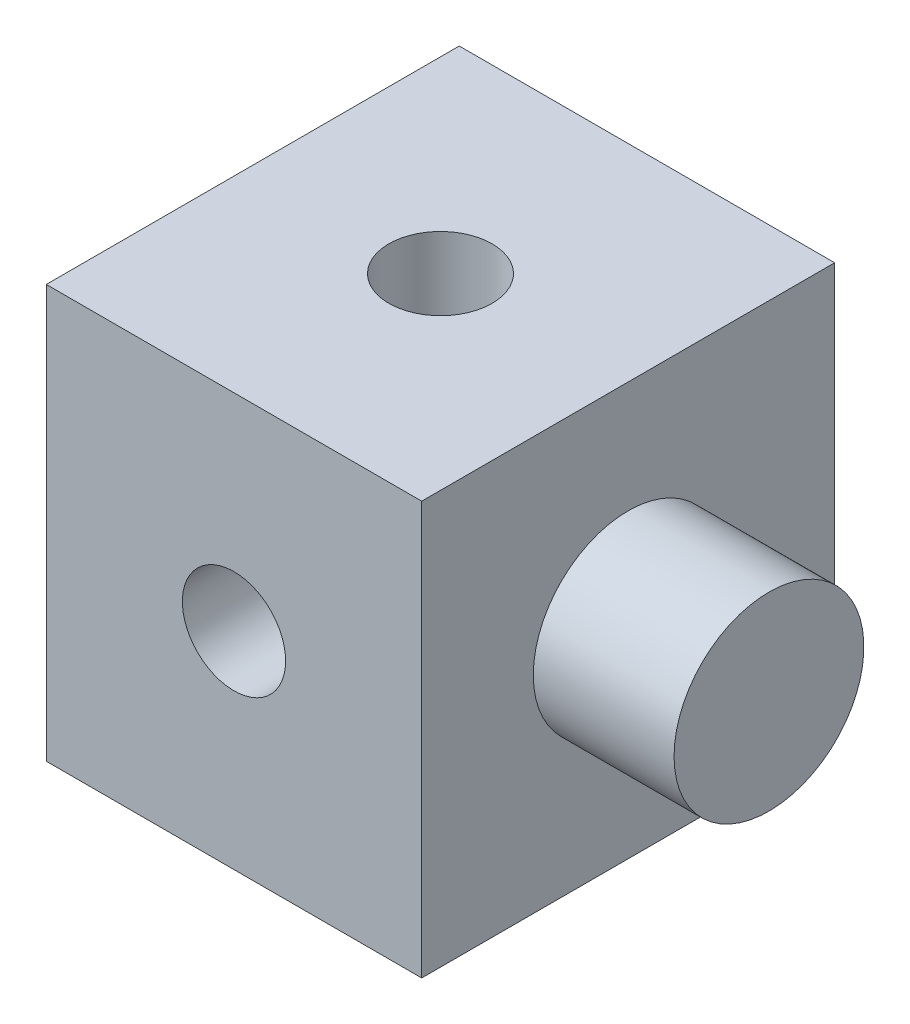
ISO-10303-21;
HEADER;
FILE_DESCRIPTION(('STEP AP214'),'2;1');
FILE_NAME('part.step','',(''),(''),'','','');
FILE_SCHEMA(('AUTOMOTIVE_DESIGN { 1 0 10303 214 1 1 1 1 }'));
ENDSEC;
DATA;
#1=APPLICATION_CONTEXT('core data for automotive mechanical design processes');
#2=APPLICATION_PROTOCOL_DEFINITION('international standard','automotive_design',2000,#1);
#3=PRODUCT_CONTEXT('',#1,'mechanical');
#4=PRODUCT('Part','Part','',(#3));
#5=PRODUCT_RELATED_PRODUCT_CATEGORY('part','',(#4));
#6=PRODUCT_DEFINITION_FORMATION('','',#4);
#7=PRODUCT_DEFINITION_CONTEXT('part definition',#1,'design');
#8=PRODUCT_DEFINITION('design','',#6,#7);
#9=PRODUCT_DEFINITION_SHAPE('','',#8);
#10=(LENGTH_UNIT() NAMED_UNIT(*) SI_UNIT(.MILLI.,.METRE.));
#11=(NAMED_UNIT(*) PLANE_ANGLE_UNIT() SI_UNIT($,.RADIAN.));
#12=(NAMED_UNIT(*) SI_UNIT($,.STERADIAN.) SOLID_ANGLE_UNIT());
#13=UNCERTAINTY_MEASURE_WITH_UNIT(LENGTH_MEASURE(1.E-05),#10,'distance_accuracy_value','');
#14=(GEOMETRIC_REPRESENTATION_CONTEXT(3) GLOBAL_UNCERTAINTY_ASSIGNED_CONTEXT((#13)) GLOBAL_UNIT_ASSIGNED_CONTEXT((#10,
#11,#12)) REPRESENTATION_CONTEXT('',''));
#15=CARTESIAN_POINT('',(0.,0.,0.));
#16=DIRECTION('',(0.,0.,1.));
#17=DIRECTION('',(1.,0.,0.));
#18=AXIS2_PLACEMENT_3D('',#15,#16,#17);
#19=CARTESIAN_POINT('',(-40.,22.,22.));
#20=DIRECTION('',(1.,0.,0.));
#21=DIRECTION('',(0.,0.,-1.));
#22=AXIS2_PLACEMENT_3D('',#19,#20,#21);
#23=PLANE('',#22);
#24=CARTESIAN_POINT('',(-40.,0.,0.));
#25=DIRECTION('',(1.,0.,0.));
#26=DIRECTION('',(0.,0.,-1.));
#27=AXIS2_PLACEMENT_3D('',#24,#25,#26);
#28=CIRCLE('',#27,7.2);
#29=CARTESIAN_POINT('',(-40.,0.,-7.2));
#30=VERTEX_POINT('',#29);
#31=EDGE_CURVE('E116',#30,#30,#28,.F.);
#32=ORIENTED_EDGE('',*,*,#31,.F.);
#33=EDGE_LOOP('',(#32));
#34=FACE_BOUND('',#33,.T.);
#35=DIRECTION('',(0.,-1.,0.));
#36=VECTOR('',#35,1.);
#37=CARTESIAN_POINT('',(-40.,22.,-22.));
#38=LINE('',#37,#36);
#39=CARTESIAN_POINT('',(-40.,22.,-22.));
#40=VERTEX_POINT('',#39);
#41=CARTESIAN_POINT('',(-40.,-22.,-22.));
#42=VERTEX_POINT('',#41);
#43=EDGE_CURVE('E110',#40,#42,#38,.T.);
#44=ORIENTED_EDGE('',*,*,#43,.T.);
#45=DIRECTION('',(0.,0.,-1.));
#46=VECTOR('',#45,1.);
#47=CARTESIAN_POINT('',(-40.,-22.,22.));
#48=LINE('',#47,#46);
#49=CARTESIAN_POINT('',(-40.,-22.,22.));
#50=VERTEX_POINT('',#49);
#51=EDGE_CURVE('E11',#50,#42,#48,.T.);
#52=ORIENTED_EDGE('',*,*,#51,.F.);
#53=DIRECTION('',(0.,-1.,0.));
#54=VECTOR('',#53,1.);
#55=CARTESIAN_POINT('',(-40.,22.,22.));
#56=LINE('',#55,#54);
#57=CARTESIAN_POINT('',(-40.,22.,22.));
#58=VERTEX_POINT('',#57);
#59=EDGE_CURVE('E91',#58,#50,#56,.T.);
#60=ORIENTED_EDGE('',*,*,#59,.F.);
#61=DIRECTION('',(0.,0.,-1.));
#62=VECTOR('',#61,1.);
#63=CARTESIAN_POINT('',(-40.,22.,22.));
#64=LINE('',#63,#62);
#65=EDGE_CURVE('E101',#58,#40,#64,.T.);
#66=ORIENTED_EDGE('',*,*,#65,.T.);
#67=EDGE_LOOP('',(#44,#52,#60,#66));
#68=FACE_BOUND('',#67,.T.);
#69=ADVANCED_FACE('F41',(#34,#68),#23,.F.);
#70=CARTESIAN_POINT('',(-40.,-22.,22.));
#71=DIRECTION('',(0.,1.,0.));
#72=DIRECTION('',(0.,0.,1.));
#73=AXIS2_PLACEMENT_3D('',#70,#71,#72);
#74=PLANE('',#73);
#75=CARTESIAN_POINT('',(-20.,-22.,0.));
#76=DIRECTION('',(0.,1.,0.));
#77=DIRECTION('',(0.,0.,1.));
#78=AXIS2_PLACEMENT_3D('',#75,#76,#77);
#79=CIRCLE('',#78,5.5);
#80=CARTESIAN_POINT('',(-20.,-22.,5.5));
#81=VERTEX_POINT('',#80);
#82=EDGE_CURVE('E123',#81,#81,#79,.T.);
#83=ORIENTED_EDGE('',*,*,#82,.T.);
#84=EDGE_LOOP('',(#83));
#85=FACE_BOUND('',#84,.T.);
#86=DIRECTION('',(1.,0.,0.));
#87=VECTOR('',#86,1.);
#88=CARTESIAN_POINT('',(-40.,-22.,-22.));
#89=LINE('',#88,#87);
#90=CARTESIAN_POINT('',(0.,-22.,-22.));
#91=VERTEX_POINT('',#90);
#92=EDGE_CURVE('E96',#42,#91,#89,.T.);
#93=ORIENTED_EDGE('',*,*,#92,.T.);
#94=DIRECTION('',(0.,0.,-1.));
#95=VECTOR('',#94,1.);
#96=CARTESIAN_POINT('',(0.,-22.,22.));
#97=LINE('',#96,#95);
#98=CARTESIAN_POINT('',(0.,-22.,22.));
#99=VERTEX_POINT('',#98);
#100=EDGE_CURVE('E49',#99,#91,#97,.T.);
#101=ORIENTED_EDGE('',*,*,#100,.F.);
#102=DIRECTION('',(1.,0.,0.));
#103=VECTOR('',#102,1.);
#104=CARTESIAN_POINT('',(-40.,-22.,22.));
#105=LINE('',#104,#103);
#106=EDGE_CURVE('E89',#50,#99,#105,.T.);
#107=ORIENTED_EDGE('',*,*,#106,.F.);
#108=ORIENTED_EDGE('',*,*,#51,.T.);
#109=EDGE_LOOP('',(#93,#101,#107,#108));
#110=FACE_BOUND('',#109,.T.);
#111=ADVANCED_FACE('F97',(#85,#110),#74,.F.);
#112=CARTESIAN_POINT('',(0.,-22.,22.));
#113=DIRECTION('',(-1.,0.,0.));
#114=DIRECTION('',(0.,0.,1.));
#115=AXIS2_PLACEMENT_3D('',#112,#113,#114);
#116=PLANE('',#115);
#117=CARTESIAN_POINT('',(0.,0.,0.));
#118=DIRECTION('',(-1.,0.,0.));
#119=DIRECTION('',(0.,0.,1.));
#120=AXIS2_PLACEMENT_3D('',#117,#118,#119);
#121=CIRCLE('',#120,10.1125);
#122=CARTESIAN_POINT('',(0.,0.,10.1125));
#123=VERTEX_POINT('',#122);
#124=EDGE_CURVE('E118',#123,#123,#121,.T.);
#125=ORIENTED_EDGE('',*,*,#124,.T.);
#126=EDGE_LOOP('',(#125));
#127=FACE_BOUND('',#126,.T.);
#128=DIRECTION('',(0.,1.,0.));
#129=VECTOR('',#128,1.);
#130=CARTESIAN_POINT('',(0.,-22.,-22.));
#131=LINE('',#130,#129);
#132=CARTESIAN_POINT('',(0.,22.,-22.));
#133=VERTEX_POINT('',#132);
#134=EDGE_CURVE('E77',#91,#133,#131,.T.);
#135=ORIENTED_EDGE('',*,*,#134,.T.);
#136=DIRECTION('',(0.,0.,-1.));
#137=VECTOR('',#136,1.);
#138=CARTESIAN_POINT('',(0.,22.,22.));
#139=LINE('',#138,#137);
#140=CARTESIAN_POINT('',(0.,22.,22.));
#141=VERTEX_POINT('',#140);
#142=EDGE_CURVE('E100',#141,#133,#139,.T.);
#143=ORIENTED_EDGE('',*,*,#142,.F.);
#144=DIRECTION('',(0.,1.,0.));
#145=VECTOR('',#144,1.);
#146=CARTESIAN_POINT('',(0.,-22.,22.));
#147=LINE('',#146,#145);
#148=EDGE_CURVE('E94',#99,#141,#147,.T.);
#149=ORIENTED_EDGE('',*,*,#148,.F.);
#150=ORIENTED_EDGE('',*,*,#100,.T.);
#151=EDGE_LOOP('',(#135,#143,#149,#150));
#152=FACE_BOUND('',#151,.T.);
#153=ADVANCED_FACE('F103',(#127,#152),#116,.F.);
#154=CARTESIAN_POINT('',(0.,22.,22.));
#155=DIRECTION('',(0.,-1.,0.));
#156=DIRECTION('',(0.,0.,-1.));
#157=AXIS2_PLACEMENT_3D('',#154,#155,#156);
#158=PLANE('',#157);
#159=CARTESIAN_POINT('',(-20.,22.,0.));
#160=DIRECTION('',(0.,-1.,0.));
#161=DIRECTION('',(0.,0.,-1.));
#162=AXIS2_PLACEMENT_3D('',#159,#160,#161);
#163=CIRCLE('',#162,5.5);
#164=CARTESIAN_POINT('',(-20.,22.,-5.5));
#165=VERTEX_POINT('',#164);
#166=EDGE_CURVE('E122',#165,#165,#163,.T.);
#167=ORIENTED_EDGE('',*,*,#166,.T.);
#168=EDGE_LOOP('',(#167));
#169=FACE_BOUND('',#168,.T.);
#170=DIRECTION('',(-1.,0.,0.));
#171=VECTOR('',#170,1.);
#172=CARTESIAN_POINT('',(0.,22.,-22.));
#173=LINE('',#172,#171);
#174=EDGE_CURVE('E81',#133,#40,#173,.T.);
#175=ORIENTED_EDGE('',*,*,#174,.T.);
#176=ORIENTED_EDGE('',*,*,#65,.F.);
#177=DIRECTION('',(-1.,0.,0.));
#178=VECTOR('',#177,1.);
#179=CARTESIAN_POINT('',(0.,22.,22.));
#180=LINE('',#179,#178);
#181=EDGE_CURVE('E56',#141,#58,#180,.T.);
#182=ORIENTED_EDGE('',*,*,#181,.F.);
#183=ORIENTED_EDGE('',*,*,#142,.T.);
#184=EDGE_LOOP('',(#175,#176,#182,#183));
#185=FACE_BOUND('',#184,.T.);
#186=ADVANCED_FACE('F175',(#169,#185),#158,.F.);
#187=CARTESIAN_POINT('',(0.,0.,22.));
#188=DIRECTION('',(0.,0.,1.));
#189=DIRECTION('',(1.,0.,0.));
#190=AXIS2_PLACEMENT_3D('',#187,#188,#189);
#191=PLANE('',#190);
#192=CARTESIAN_POINT('',(-20.,0.,22.));
#193=DIRECTION('',(0.,0.,1.));
#194=DIRECTION('',(1.,0.,0.));
#195=AXIS2_PLACEMENT_3D('',#192,#193,#194);
#196=CIRCLE('',#195,5.5);
#197=CARTESIAN_POINT('',(-14.5,0.,22.));
#198=VERTEX_POINT('',#197);
#199=EDGE_CURVE('E130',#198,#198,#196,.F.);
#200=ORIENTED_EDGE('',*,*,#199,.T.);
#201=EDGE_LOOP('',(#200));
#202=FACE_BOUND('',#201,.T.);
#203=ORIENTED_EDGE('',*,*,#59,.T.);
#204=ORIENTED_EDGE('',*,*,#106,.T.);
#205=ORIENTED_EDGE('',*,*,#148,.T.);
#206=ORIENTED_EDGE('',*,*,#181,.T.);
#207=EDGE_LOOP('',(#203,#204,#205,#206));
#208=FACE_BOUND('',#207,.T.);
#209=ADVANCED_FACE('F86',(#202,#208),#191,.T.);
#210=CARTESIAN_POINT('',(0.,0.,-22.));
#211=DIRECTION('',(0.,0.,1.));
#212=DIRECTION('',(1.,0.,0.));
#213=AXIS2_PLACEMENT_3D('',#210,#211,#212);
#214=PLANE('',#213);
#215=CARTESIAN_POINT('',(-20.,0.,-22.));
#216=DIRECTION('',(0.,0.,1.));
#217=DIRECTION('',(1.,0.,0.));
#218=AXIS2_PLACEMENT_3D('',#215,#216,#217);
#219=CIRCLE('',#218,5.5);
#220=CARTESIAN_POINT('',(-14.5,0.,-22.));
#221=VERTEX_POINT('',#220);
#222=EDGE_CURVE('E42',#221,#221,#219,.T.);
#223=ORIENTED_EDGE('',*,*,#222,.T.);
#224=EDGE_LOOP('',(#223));
#225=FACE_BOUND('',#224,.T.);
#226=ORIENTED_EDGE('',*,*,#43,.F.);
#227=ORIENTED_EDGE('',*,*,#174,.F.);
#228=ORIENTED_EDGE('',*,*,#134,.F.);
#229=ORIENTED_EDGE('',*,*,#92,.F.);
#230=EDGE_LOOP('',(#226,#227,#228,#229));
#231=FACE_BOUND('',#230,.T.);
#232=ADVANCED_FACE('F139',(#225,#231),#214,.F.);
#233=CARTESIAN_POINT('',(15.,0.,0.));
#234=DIRECTION('',(-1.,0.,0.));
#235=DIRECTION('',(0.,0.,1.));
#236=AXIS2_PLACEMENT_3D('',#233,#234,#235);
#237=PLANE('',#236);
#238=CARTESIAN_POINT('',(14.9999999999999,0.,0.));
#239=DIRECTION('',(-1.,0.,0.));
#240=DIRECTION('',(0.,0.,1.));
#241=AXIS2_PLACEMENT_3D('',#238,#239,#240);
#242=CIRCLE('',#241,10.1125);
#243=CARTESIAN_POINT('',(14.9999999999999,0.,10.1125));
#244=VERTEX_POINT('',#243);
#245=EDGE_CURVE('E109',#244,#244,#242,.T.);
#246=ORIENTED_EDGE('',*,*,#245,.F.);
#247=EDGE_LOOP('',(#246));
#248=FACE_BOUND('',#247,.T.);
#249=ADVANCED_FACE('F161',(#248),#237,.F.);
#250=CARTESIAN_POINT('',(-1000.,0.,0.));
#251=DIRECTION('',(-1.,0.,0.));
#252=DIRECTION('',(0.,0.,1.));
#253=AXIS2_PLACEMENT_3D('',#250,#251,#252);
#254=CYLINDRICAL_SURFACE('',#253,10.1125);
#255=ORIENTED_EDGE('',*,*,#124,.F.);
#256=EDGE_LOOP('',(#255));
#257=FACE_BOUND('',#256,.T.);
#258=ORIENTED_EDGE('',*,*,#245,.T.);
#259=EDGE_LOOP('',(#258));
#260=FACE_BOUND('',#259,.T.);
#261=ADVANCED_FACE('F169',(#257,#260),#254,.T.);
#262=CARTESIAN_POINT('',(-1000.,0.,0.));
#263=DIRECTION('',(-1.,0.,0.));
#264=DIRECTION('',(0.,0.,1.));
#265=AXIS2_PLACEMENT_3D('',#262,#263,#264);
#266=CYLINDRICAL_SURFACE('',#265,7.2);
#267=CARTESIAN_POINT('',(-26.,0.,0.));
#268=DIRECTION('',(-1.,0.,0.));
#269=DIRECTION('',(0.,0.,1.));
#270=AXIS2_PLACEMENT_3D('',#267,#268,#269);
#271=CIRCLE('',#270,7.2);
#272=CARTESIAN_POINT('',(-26.,0.,7.2));
#273=VERTEX_POINT('',#272);
#274=EDGE_CURVE('E119',#273,#273,#271,.T.);
#275=ORIENTED_EDGE('',*,*,#274,.F.);
#276=EDGE_LOOP('',(#275));
#277=FACE_BOUND('',#276,.T.);
#278=ORIENTED_EDGE('',*,*,#31,.T.);
#279=EDGE_LOOP('',(#278));
#280=FACE_BOUND('',#279,.T.);
#281=ADVANCED_FACE('F209',(#277,#280),#266,.F.);
#282=CARTESIAN_POINT('',(-26.,0.,0.));
#283=DIRECTION('',(-1.,0.,0.));
#284=DIRECTION('',(0.,0.,1.));
#285=AXIS2_PLACEMENT_3D('',#282,#283,#284);
#286=PLANE('',#285);
#287=ORIENTED_EDGE('',*,*,#274,.T.);
#288=EDGE_LOOP('',(#287));
#289=FACE_BOUND('',#288,.T.);
#290=ADVANCED_FACE('F207',(#289),#286,.T.);
#291=CARTESIAN_POINT('',(-20.,-40.,0.));
#292=DIRECTION('',(0.,-1.,0.));
#293=DIRECTION('',(0.,0.,-1.));
#294=AXIS2_PLACEMENT_3D('',#291,#292,#293);
#295=CYLINDRICAL_SURFACE('',#294,5.5);
#296=CARTESIAN_POINT('',(-20.,8.,0.));
#297=DIRECTION('',(0.,-1.,0.));
#298=DIRECTION('',(0.,0.,-1.));
#299=AXIS2_PLACEMENT_3D('',#296,#297,#298);
#300=CIRCLE('',#299,5.5);
#301=CARTESIAN_POINT('',(-20.,8.,-5.5));
#302=VERTEX_POINT('',#301);
#303=EDGE_CURVE('E121',#302,#302,#300,.T.);
#304=ORIENTED_EDGE('',*,*,#303,.T.);
#305=EDGE_LOOP('',(#304));
#306=FACE_BOUND('',#305,.T.);
#307=ORIENTED_EDGE('',*,*,#166,.F.);
#308=EDGE_LOOP('',(#307));
#309=FACE_BOUND('',#308,.T.);
#310=ADVANCED_FACE('F193',(#306,#309),#295,.F.);
#311=CARTESIAN_POINT('',(-20.,8.,0.));
#312=DIRECTION('',(0.,-1.,0.));
#313=DIRECTION('',(0.,0.,-1.));
#314=AXIS2_PLACEMENT_3D('',#311,#312,#313);
#315=PLANE('',#314);
#316=ORIENTED_EDGE('',*,*,#303,.F.);
#317=EDGE_LOOP('',(#316));
#318=FACE_BOUND('',#317,.T.);
#319=ADVANCED_FACE('F200',(#318),#315,.F.);
#320=CARTESIAN_POINT('',(-20.,-40.,0.));
#321=DIRECTION('',(0.,-1.,0.));
#322=DIRECTION('',(0.,0.,-1.));
#323=AXIS2_PLACEMENT_3D('',#320,#321,#322);
#324=CYLINDRICAL_SURFACE('',#323,5.5);
#325=CARTESIAN_POINT('',(-20.,-8.,0.));
#326=DIRECTION('',(0.,-1.,0.));
#327=DIRECTION('',(0.,0.,-1.));
#328=AXIS2_PLACEMENT_3D('',#325,#326,#327);
#329=CIRCLE('',#328,5.5);
#330=CARTESIAN_POINT('',(-20.,-8.,-5.5));
#331=VERTEX_POINT('',#330);
#332=EDGE_CURVE('E126',#331,#331,#329,.T.);
#333=ORIENTED_EDGE('',*,*,#332,.F.);
#334=EDGE_LOOP('',(#333));
#335=FACE_BOUND('',#334,.T.);
#336=ORIENTED_EDGE('',*,*,#82,.F.);
#337=EDGE_LOOP('',(#336));
#338=FACE_BOUND('',#337,.T.);
#339=ADVANCED_FACE('F148',(#335,#338),#324,.F.);
#340=CARTESIAN_POINT('',(-14.5,-8.,0.));
#341=DIRECTION('',(0.,1.,0.));
#342=DIRECTION('',(0.,0.,1.));
#343=AXIS2_PLACEMENT_3D('',#340,#341,#342);
#344=PLANE('',#343);
#345=ORIENTED_EDGE('',*,*,#332,.T.);
#346=EDGE_LOOP('',(#345));
#347=FACE_BOUND('',#346,.T.);
#348=ADVANCED_FACE('F145',(#347),#344,.F.);
#349=CARTESIAN_POINT('',(-20.,0.,23.));
#350=DIRECTION('',(0.,0.,-1.));
#351=DIRECTION('',(-1.,0.,0.));
#352=AXIS2_PLACEMENT_3D('',#349,#350,#351);
#353=CYLINDRICAL_SURFACE('',#352,5.5);
#354=ORIENTED_EDGE('',*,*,#199,.F.);
#355=EDGE_LOOP('',(#354));
#356=FACE_BOUND('',#355,.T.);
#357=ORIENTED_EDGE('',*,*,#222,.F.);
#358=EDGE_LOOP('',(#357));
#359=FACE_BOUND('',#358,.T.);
#360=ADVANCED_FACE('F138',(#356,#359),#353,.F.);
#361=CLOSED_SHELL('',(#69,#111,#153,#186,#209,#232,#249,#261,#281,#290,#310,#319,#339,#348,#360));
#362=MANIFOLD_SOLID_BREP('B2',#361);
#363=ADVANCED_BREP_SHAPE_REPRESENTATION('',(#18,#362),#14);
#364=SHAPE_DEFINITION_REPRESENTATION(#9,#363);
ENDSEC;
END-ISO-10303-21;
